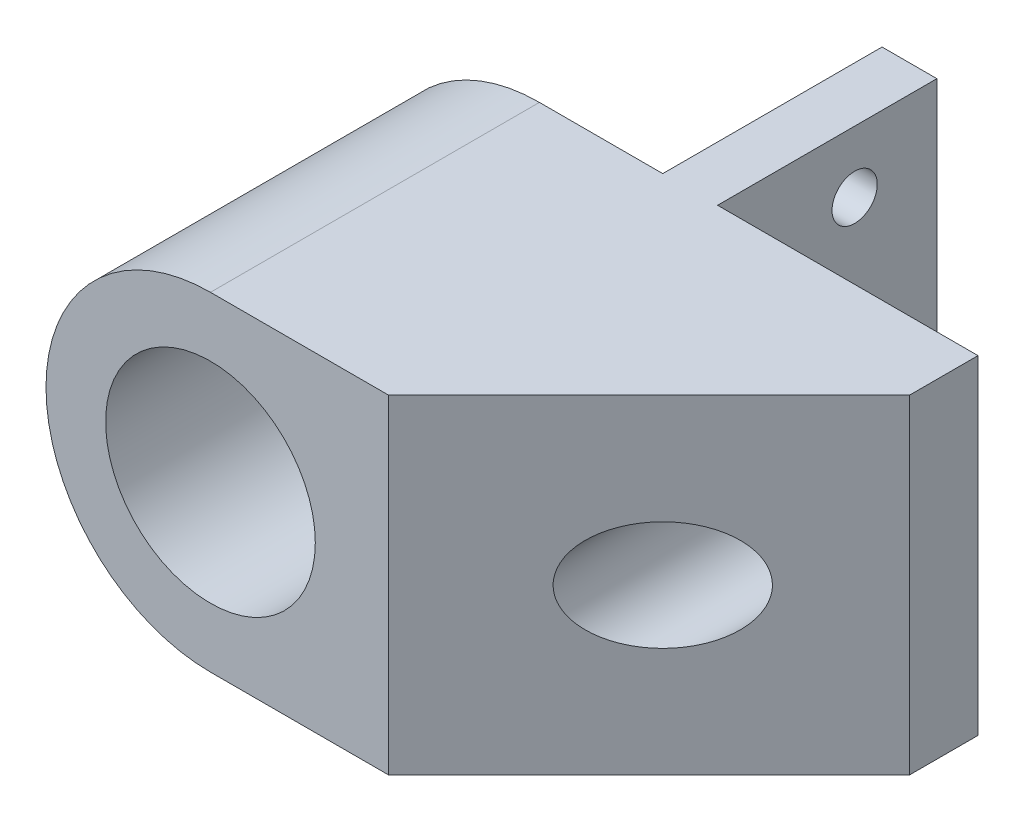
ISO-10303-21;
HEADER;
FILE_DESCRIPTION(('STEP AP214'),'2;1');
FILE_NAME('part.step','',(''),(''),'','','');
FILE_SCHEMA(('AUTOMOTIVE_DESIGN { 1 0 10303 214 1 1 1 1 }'));
ENDSEC;
DATA;
#1=APPLICATION_CONTEXT('core data for automotive mechanical design processes');
#2=APPLICATION_PROTOCOL_DEFINITION('international standard','automotive_design',2000,#1);
#3=PRODUCT_CONTEXT('',#1,'mechanical');
#4=PRODUCT('Part','Part','',(#3));
#5=PRODUCT_RELATED_PRODUCT_CATEGORY('part','',(#4));
#6=PRODUCT_DEFINITION_FORMATION('','',#4);
#7=PRODUCT_DEFINITION_CONTEXT('part definition',#1,'design');
#8=PRODUCT_DEFINITION('design','',#6,#7);
#9=PRODUCT_DEFINITION_SHAPE('','',#8);
#10=(LENGTH_UNIT() NAMED_UNIT(*) SI_UNIT(.MILLI.,.METRE.));
#11=(NAMED_UNIT(*) PLANE_ANGLE_UNIT() SI_UNIT($,.RADIAN.));
#12=(NAMED_UNIT(*) SI_UNIT($,.STERADIAN.) SOLID_ANGLE_UNIT());
#13=UNCERTAINTY_MEASURE_WITH_UNIT(LENGTH_MEASURE(1.E-05),#10,'distance_accuracy_value','');
#14=(GEOMETRIC_REPRESENTATION_CONTEXT(3) GLOBAL_UNCERTAINTY_ASSIGNED_CONTEXT((#13)) GLOBAL_UNIT_ASSIGNED_CONTEXT((#10,
#11,#12)) REPRESENTATION_CONTEXT('',''));
#15=CARTESIAN_POINT('',(0.,0.,0.));
#16=DIRECTION('',(0.,0.,1.));
#17=DIRECTION('',(1.,0.,0.));
#18=AXIS2_PLACEMENT_3D('',#15,#16,#17);
#19=CARTESIAN_POINT('',(-9.,-12.,40.));
#20=DIRECTION('',(0.,0.,-1.));
#21=DIRECTION('',(-1.,0.,0.));
#22=AXIS2_PLACEMENT_3D('',#19,#20,#21);
#23=CYLINDRICAL_SURFACE('',#22,1.6);
#24=CARTESIAN_POINT('',(-9.,-12.,16.));
#25=DIRECTION('',(0.,0.,1.));
#26=DIRECTION('',(1.,0.,0.));
#27=AXIS2_PLACEMENT_3D('',#24,#25,#26);
#28=CIRCLE('',#27,1.6);
#29=CARTESIAN_POINT('',(-7.4,-12.,16.));
#30=VERTEX_POINT('',#29);
#31=EDGE_CURVE('E146',#30,#30,#28,.T.);
#32=ORIENTED_EDGE('',*,*,#31,.F.);
#33=EDGE_LOOP('',(#32));
#34=FACE_BOUND('',#33,.T.);
#35=CARTESIAN_POINT('',(-9.,-12.,21.0000000000002));
#36=DIRECTION('',(0.,0.,1.));
#37=DIRECTION('',(1.,0.,0.));
#38=AXIS2_PLACEMENT_3D('',#35,#36,#37);
#39=CIRCLE('',#38,1.6);
#40=CARTESIAN_POINT('',(-7.4,-12.,21.0000000000002));
#41=VERTEX_POINT('',#40);
#42=EDGE_CURVE('E36',#41,#41,#39,.T.);
#43=ORIENTED_EDGE('',*,*,#42,.T.);
#44=EDGE_LOOP('',(#43));
#45=FACE_BOUND('',#44,.T.);
#46=ADVANCED_FACE('F32',(#34,#45),#23,.F.);
#47=CARTESIAN_POINT('',(-19.,-30.,40.));
#48=DIRECTION('',(-1.,0.,0.));
#49=DIRECTION('',(0.,0.,1.));
#50=AXIS2_PLACEMENT_3D('',#47,#48,#49);
#51=PLANE('',#50);
#52=CARTESIAN_POINT('',(-19.,-4.5,6.00000000000001));
#53=DIRECTION('',(-1.,0.,0.));
#54=DIRECTION('',(0.,0.,1.));
#55=AXIS2_PLACEMENT_3D('',#52,#53,#54);
#56=CIRCLE('',#55,1.65);
#57=CARTESIAN_POINT('',(-19.,-4.5,7.65000000000001));
#58=VERTEX_POINT('',#57);
#59=EDGE_CURVE('E154',#58,#58,#56,.T.);
#60=ORIENTED_EDGE('',*,*,#59,.T.);
#61=EDGE_LOOP('',(#60));
#62=FACE_BOUND('',#61,.T.);
#63=CARTESIAN_POINT('',(-19.,-19.5,6.00000000000001));
#64=DIRECTION('',(-1.,0.,0.));
#65=DIRECTION('',(0.,0.,1.));
#66=AXIS2_PLACEMENT_3D('',#63,#64,#65);
#67=CIRCLE('',#66,1.65);
#68=CARTESIAN_POINT('',(-19.,-19.5,7.65000000000001));
#69=VERTEX_POINT('',#68);
#70=EDGE_CURVE('E159',#69,#69,#67,.T.);
#71=ORIENTED_EDGE('',*,*,#70,.T.);
#72=EDGE_LOOP('',(#71));
#73=FACE_BOUND('',#72,.T.);
#74=DIRECTION('',(0.,1.,0.));
#75=VECTOR('',#74,1.);
#76=CARTESIAN_POINT('',(-19.,-30.,0.));
#77=LINE('',#76,#75);
#78=CARTESIAN_POINT('',(-19.,-24.,0.));
#79=VERTEX_POINT('',#78);
#80=CARTESIAN_POINT('',(-19.,0.,0.));
#81=VERTEX_POINT('',#80);
#82=EDGE_CURVE('E119',#79,#81,#77,.T.);
#83=ORIENTED_EDGE('',*,*,#82,.T.);
#84=DIRECTION('',(0.,0.,1.));
#85=VECTOR('',#84,1.);
#86=CARTESIAN_POINT('',(-19.,0.,40.));
#87=LINE('',#86,#85);
#88=CARTESIAN_POINT('',(-19.,0.,16.));
#89=VERTEX_POINT('',#88);
#90=EDGE_CURVE('E162',#81,#89,#87,.T.);
#91=ORIENTED_EDGE('',*,*,#90,.T.);
#92=DIRECTION('',(0.,1.,0.));
#93=VECTOR('',#92,1.);
#94=CARTESIAN_POINT('',(-19.,-30.,16.));
#95=LINE('',#94,#93);
#96=CARTESIAN_POINT('',(-19.,-24.,16.));
#97=VERTEX_POINT('',#96);
#98=EDGE_CURVE('E191',#97,#89,#95,.T.);
#99=ORIENTED_EDGE('',*,*,#98,.F.);
#100=DIRECTION('',(0.,0.,-1.));
#101=VECTOR('',#100,1.);
#102=CARTESIAN_POINT('',(-19.,-24.,40.));
#103=LINE('',#102,#101);
#104=EDGE_CURVE('E180',#97,#79,#103,.T.);
#105=ORIENTED_EDGE('',*,*,#104,.T.);
#106=EDGE_LOOP('',(#83,#91,#99,#105));
#107=FACE_BOUND('',#106,.T.);
#108=ADVANCED_FACE('F239',(#62,#73,#107),#51,.F.);
#109=CARTESIAN_POINT('',(-32.,-12.,40.));
#110=DIRECTION('',(0.,0.,1.));
#111=DIRECTION('',(1.,0.,0.));
#112=AXIS2_PLACEMENT_3D('',#109,#110,#111);
#113=PLANE('',#112);
#114=DIRECTION('',(0.,1.,0.));
#115=VECTOR('',#114,1.);
#116=CARTESIAN_POINT('',(-19.,6.,40.));
#117=LINE('',#116,#115);
#118=CARTESIAN_POINT('',(-19.,-24.,40.));
#119=VERTEX_POINT('',#118);
#120=CARTESIAN_POINT('',(-19.,0.,40.));
#121=VERTEX_POINT('',#120);
#122=EDGE_CURVE('E127',#119,#121,#117,.T.);
#123=ORIENTED_EDGE('',*,*,#122,.T.);
#124=DIRECTION('',(-1.,0.,0.));
#125=VECTOR('',#124,1.);
#126=CARTESIAN_POINT('',(-23.,0.,40.));
#127=LINE('',#126,#125);
#128=CARTESIAN_POINT('',(-32.,0.,40.));
#129=VERTEX_POINT('',#128);
#130=EDGE_CURVE('E201',#121,#129,#127,.T.);
#131=ORIENTED_EDGE('',*,*,#130,.T.);
#132=CARTESIAN_POINT('',(-32.,-12.,40.));
#133=DIRECTION('',(0.,0.,1.));
#134=DIRECTION('',(1.,0.,0.));
#135=AXIS2_PLACEMENT_3D('',#132,#133,#134);
#136=CIRCLE('',#135,12.);
#137=CARTESIAN_POINT('',(-32.,-24.,40.));
#138=VERTEX_POINT('',#137);
#139=EDGE_CURVE('E202',#129,#138,#136,.T.);
#140=ORIENTED_EDGE('',*,*,#139,.T.);
#141=DIRECTION('',(1.,0.,0.));
#142=VECTOR('',#141,1.);
#143=CARTESIAN_POINT('',(-32.,-24.,40.));
#144=LINE('',#143,#142);
#145=EDGE_CURVE('E133',#138,#119,#144,.T.);
#146=ORIENTED_EDGE('',*,*,#145,.T.);
#147=EDGE_LOOP('',(#123,#131,#140,#146));
#148=FACE_BOUND('',#147,.T.);
#149=CARTESIAN_POINT('',(-32.,-12.,40.));
#150=DIRECTION('',(0.,0.,1.));
#151=DIRECTION('',(1.,0.,0.));
#152=AXIS2_PLACEMENT_3D('',#149,#150,#151);
#153=CIRCLE('',#152,7.65);
#154=CARTESIAN_POINT('',(-24.35,-12.,40.));
#155=VERTEX_POINT('',#154);
#156=EDGE_CURVE('E125',#155,#155,#153,.T.);
#157=ORIENTED_EDGE('',*,*,#156,.F.);
#158=EDGE_LOOP('',(#157));
#159=FACE_BOUND('',#158,.T.);
#160=ADVANCED_FACE('F209',(#148,#159),#113,.T.);
#161=CARTESIAN_POINT('',(-32.,-12.,0.));
#162=DIRECTION('',(0.,0.,1.));
#163=DIRECTION('',(1.,0.,0.));
#164=AXIS2_PLACEMENT_3D('',#161,#162,#163);
#165=PLANE('',#164);
#166=DIRECTION('',(0.,-1.,0.));
#167=VECTOR('',#166,1.);
#168=CARTESIAN_POINT('',(-23.,-24.,0.));
#169=LINE('',#168,#167);
#170=CARTESIAN_POINT('',(-23.,0.,0.));
#171=VERTEX_POINT('',#170);
#172=CARTESIAN_POINT('',(-23.,-24.,0.));
#173=VERTEX_POINT('',#172);
#174=EDGE_CURVE('E117',#171,#173,#169,.T.);
#175=ORIENTED_EDGE('',*,*,#174,.F.);
#176=DIRECTION('',(-1.,0.,0.));
#177=VECTOR('',#176,1.);
#178=CARTESIAN_POINT('',(-3.,0.,0.));
#179=LINE('',#178,#177);
#180=EDGE_CURVE('E110',#81,#171,#179,.T.);
#181=ORIENTED_EDGE('',*,*,#180,.F.);
#182=ORIENTED_EDGE('',*,*,#82,.F.);
#183=DIRECTION('',(-1.,0.,0.));
#184=VECTOR('',#183,1.);
#185=CARTESIAN_POINT('',(-3.,-24.,0.));
#186=LINE('',#185,#184);
#187=EDGE_CURVE('E101',#79,#173,#186,.T.);
#188=ORIENTED_EDGE('',*,*,#187,.T.);
#189=EDGE_LOOP('',(#175,#181,#182,#188));
#190=FACE_BOUND('',#189,.T.);
#191=ADVANCED_FACE('F115',(#190),#165,.F.);
#192=CARTESIAN_POINT('',(0.,-24.,40.));
#193=DIRECTION('',(-1.,0.,0.));
#194=DIRECTION('',(0.,0.,1.));
#195=AXIS2_PLACEMENT_3D('',#192,#193,#194);
#196=PLANE('',#195);
#197=DIRECTION('',(0.,0.,-1.));
#198=VECTOR('',#197,1.);
#199=CARTESIAN_POINT('',(0.,-24.,40.));
#200=LINE('',#199,#198);
#201=CARTESIAN_POINT('',(0.,-24.,21.0000000000002));
#202=VERTEX_POINT('',#201);
#203=CARTESIAN_POINT('',(0.,-24.,16.));
#204=VERTEX_POINT('',#203);
#205=EDGE_CURVE('E48',#202,#204,#200,.T.);
#206=ORIENTED_EDGE('',*,*,#205,.T.);
#207=DIRECTION('',(0.,1.,0.));
#208=VECTOR('',#207,1.);
#209=CARTESIAN_POINT('',(0.,-30.,16.));
#210=LINE('',#209,#208);
#211=CARTESIAN_POINT('',(0.,0.,16.));
#212=VERTEX_POINT('',#211);
#213=EDGE_CURVE('E188',#204,#212,#210,.T.);
#214=ORIENTED_EDGE('',*,*,#213,.T.);
#215=DIRECTION('',(0.,0.,-1.));
#216=VECTOR('',#215,1.);
#217=CARTESIAN_POINT('',(0.,0.,40.));
#218=LINE('',#217,#216);
#219=CARTESIAN_POINT('',(0.,0.,21.0000000000002));
#220=VERTEX_POINT('',#219);
#221=EDGE_CURVE('E142',#220,#212,#218,.T.);
#222=ORIENTED_EDGE('',*,*,#221,.F.);
#223=DIRECTION('',(0.,1.,0.));
#224=VECTOR('',#223,1.);
#225=CARTESIAN_POINT('',(0.,-24.,21.0000000000002));
#226=LINE('',#225,#224);
#227=EDGE_CURVE('E42',#220,#202,#226,.F.);
#228=ORIENTED_EDGE('',*,*,#227,.T.);
#229=EDGE_LOOP('',(#206,#214,#222,#228));
#230=FACE_BOUND('',#229,.T.);
#231=ADVANCED_FACE('F257',(#230),#196,.F.);
#232=CARTESIAN_POINT('',(-23.,0.,40.));
#233=DIRECTION('',(0.,-1.,0.));
#234=DIRECTION('',(1.,0.,0.));
#235=AXIS2_PLACEMENT_3D('',#232,#233,#234);
#236=PLANE('',#235);
#237=ORIENTED_EDGE('',*,*,#130,.F.);
#238=DIRECTION('',(-0.707106781186544,0.,0.707106781186551));
#239=VECTOR('',#238,1.);
#240=CARTESIAN_POINT('',(-20.9999999999998,0.,42.0000000000002));
#241=LINE('',#240,#239);
#242=EDGE_CURVE('E145',#121,#220,#241,.F.);
#243=ORIENTED_EDGE('',*,*,#242,.T.);
#244=ORIENTED_EDGE('',*,*,#221,.T.);
#245=DIRECTION('',(1.,0.,0.));
#246=VECTOR('',#245,1.);
#247=CARTESIAN_POINT('',(0.,0.,16.));
#248=LINE('',#247,#246);
#249=EDGE_CURVE('E157',#89,#212,#248,.T.);
#250=ORIENTED_EDGE('',*,*,#249,.F.);
#251=ORIENTED_EDGE('',*,*,#90,.F.);
#252=ORIENTED_EDGE('',*,*,#180,.T.);
#253=DIRECTION('',(0.,0.,1.));
#254=VECTOR('',#253,1.);
#255=CARTESIAN_POINT('',(-23.,0.,0.));
#256=LINE('',#255,#254);
#257=CARTESIAN_POINT('',(-23.,0.,16.));
#258=VERTEX_POINT('',#257);
#259=EDGE_CURVE('E124',#171,#258,#256,.T.);
#260=ORIENTED_EDGE('',*,*,#259,.T.);
#261=DIRECTION('',(1.,0.,0.));
#262=VECTOR('',#261,1.);
#263=CARTESIAN_POINT('',(-44.,0.,16.));
#264=LINE('',#263,#262);
#265=CARTESIAN_POINT('',(-32.,0.,16.));
#266=VERTEX_POINT('',#265);
#267=EDGE_CURVE('E185',#266,#258,#264,.T.);
#268=ORIENTED_EDGE('',*,*,#267,.F.);
#269=DIRECTION('',(0.,0.,-1.));
#270=VECTOR('',#269,1.);
#271=CARTESIAN_POINT('',(-32.,0.,40.));
#272=LINE('',#271,#270);
#273=EDGE_CURVE('E139',#129,#266,#272,.T.);
#274=ORIENTED_EDGE('',*,*,#273,.F.);
#275=EDGE_LOOP('',(#237,#243,#244,#250,#251,#252,#260,#268,#274));
#276=FACE_BOUND('',#275,.T.);
#277=ADVANCED_FACE('F217',(#276),#236,.F.);
#278=CARTESIAN_POINT('',(-32.,-12.,40.));
#279=DIRECTION('',(0.,0.,-1.));
#280=DIRECTION('',(-1.,0.,0.));
#281=AXIS2_PLACEMENT_3D('',#278,#279,#280);
#282=CYLINDRICAL_SURFACE('',#281,12.);
#283=ORIENTED_EDGE('',*,*,#273,.T.);
#284=CARTESIAN_POINT('',(-32.,-12.,16.));
#285=DIRECTION('',(0.,0.,1.));
#286=DIRECTION('',(1.,0.,0.));
#287=AXIS2_PLACEMENT_3D('',#284,#285,#286);
#288=CIRCLE('',#287,12.);
#289=CARTESIAN_POINT('',(-32.,-24.,16.));
#290=VERTEX_POINT('',#289);
#291=EDGE_CURVE('E130',#266,#290,#288,.T.);
#292=ORIENTED_EDGE('',*,*,#291,.T.);
#293=DIRECTION('',(0.,0.,-1.));
#294=VECTOR('',#293,1.);
#295=CARTESIAN_POINT('',(-32.,-24.,40.));
#296=LINE('',#295,#294);
#297=EDGE_CURVE('E137',#138,#290,#296,.T.);
#298=ORIENTED_EDGE('',*,*,#297,.F.);
#299=ORIENTED_EDGE('',*,*,#139,.F.);
#300=EDGE_LOOP('',(#283,#292,#298,#299));
#301=FACE_BOUND('',#300,.T.);
#302=ADVANCED_FACE('F220',(#301),#282,.T.);
#303=CARTESIAN_POINT('',(-23.,-24.,40.));
#304=DIRECTION('',(1.,0.,0.));
#305=DIRECTION('',(0.,0.,-1.));
#306=AXIS2_PLACEMENT_3D('',#303,#304,#305);
#307=PLANE('',#306);
#308=CARTESIAN_POINT('',(-23.,-19.5,6.00000000000001));
#309=DIRECTION('',(-1.,0.,0.));
#310=DIRECTION('',(0.,0.,1.));
#311=AXIS2_PLACEMENT_3D('',#308,#309,#310);
#312=CIRCLE('',#311,1.65);
#313=CARTESIAN_POINT('',(-23.,-19.5,7.65000000000001));
#314=VERTEX_POINT('',#313);
#315=EDGE_CURVE('E120',#314,#314,#312,.T.);
#316=ORIENTED_EDGE('',*,*,#315,.F.);
#317=EDGE_LOOP('',(#316));
#318=FACE_BOUND('',#317,.T.);
#319=CARTESIAN_POINT('',(-23.,-4.5,6.00000000000001));
#320=DIRECTION('',(-1.,0.,0.));
#321=DIRECTION('',(0.,0.,1.));
#322=AXIS2_PLACEMENT_3D('',#319,#320,#321);
#323=CIRCLE('',#322,1.65);
#324=CARTESIAN_POINT('',(-23.,-4.5,7.65000000000001));
#325=VERTEX_POINT('',#324);
#326=EDGE_CURVE('E158',#325,#325,#323,.T.);
#327=ORIENTED_EDGE('',*,*,#326,.F.);
#328=EDGE_LOOP('',(#327));
#329=FACE_BOUND('',#328,.T.);
#330=DIRECTION('',(0.,1.,0.));
#331=VECTOR('',#330,1.);
#332=CARTESIAN_POINT('',(-23.,-30.,16.));
#333=LINE('',#332,#331);
#334=CARTESIAN_POINT('',(-23.,-24.,16.));
#335=VERTEX_POINT('',#334);
#336=EDGE_CURVE('E150',#335,#258,#333,.T.);
#337=ORIENTED_EDGE('',*,*,#336,.T.);
#338=ORIENTED_EDGE('',*,*,#259,.F.);
#339=ORIENTED_EDGE('',*,*,#174,.T.);
#340=DIRECTION('',(0.,0.,-1.));
#341=VECTOR('',#340,1.);
#342=CARTESIAN_POINT('',(-23.,-24.,40.));
#343=LINE('',#342,#341);
#344=EDGE_CURVE('E98',#335,#173,#343,.T.);
#345=ORIENTED_EDGE('',*,*,#344,.F.);
#346=EDGE_LOOP('',(#337,#338,#339,#345));
#347=FACE_BOUND('',#346,.T.);
#348=ADVANCED_FACE('F123',(#318,#329,#347),#307,.F.);
#349=CARTESIAN_POINT('',(-19.,-24.,40.));
#350=DIRECTION('',(0.,1.,0.));
#351=DIRECTION('',(0.,0.,1.));
#352=AXIS2_PLACEMENT_3D('',#349,#350,#351);
#353=PLANE('',#352);
#354=ORIENTED_EDGE('',*,*,#205,.F.);
#355=DIRECTION('',(0.707106781186544,0.,-0.707106781186551));
#356=VECTOR('',#355,1.);
#357=CARTESIAN_POINT('',(-18.9999999999998,-24.,40.0000000000002));
#358=LINE('',#357,#356);
#359=EDGE_CURVE('E11',#202,#119,#358,.F.);
#360=ORIENTED_EDGE('',*,*,#359,.T.);
#361=ORIENTED_EDGE('',*,*,#145,.F.);
#362=ORIENTED_EDGE('',*,*,#297,.T.);
#363=DIRECTION('',(1.,0.,0.));
#364=VECTOR('',#363,1.);
#365=CARTESIAN_POINT('',(-32.,-24.,16.));
#366=LINE('',#365,#364);
#367=EDGE_CURVE('E105',#290,#335,#366,.T.);
#368=ORIENTED_EDGE('',*,*,#367,.T.);
#369=ORIENTED_EDGE('',*,*,#344,.T.);
#370=ORIENTED_EDGE('',*,*,#187,.F.);
#371=ORIENTED_EDGE('',*,*,#104,.F.);
#372=DIRECTION('',(1.,0.,0.));
#373=VECTOR('',#372,1.);
#374=CARTESIAN_POINT('',(-19.,-24.,16.));
#375=LINE('',#374,#373);
#376=EDGE_CURVE('E149',#97,#204,#375,.T.);
#377=ORIENTED_EDGE('',*,*,#376,.T.);
#378=EDGE_LOOP('',(#354,#360,#361,#362,#368,#369,#370,#371,#377));
#379=FACE_BOUND('',#378,.T.);
#380=ADVANCED_FACE('F100',(#379),#353,.F.);
#381=CARTESIAN_POINT('',(-32.,-12.,40.));
#382=DIRECTION('',(0.,0.,-1.));
#383=DIRECTION('',(-1.,0.,0.));
#384=AXIS2_PLACEMENT_3D('',#381,#382,#383);
#385=CYLINDRICAL_SURFACE('',#384,7.65);
#386=CARTESIAN_POINT('',(-32.,-12.,16.));
#387=DIRECTION('',(0.,0.,1.));
#388=DIRECTION('',(1.,0.,0.));
#389=AXIS2_PLACEMENT_3D('',#386,#387,#388);
#390=CIRCLE('',#389,7.65);
#391=CARTESIAN_POINT('',(-24.35,-12.,16.));
#392=VERTEX_POINT('',#391);
#393=EDGE_CURVE('E151',#392,#392,#390,.T.);
#394=ORIENTED_EDGE('',*,*,#393,.F.);
#395=EDGE_LOOP('',(#394));
#396=FACE_BOUND('',#395,.T.);
#397=ORIENTED_EDGE('',*,*,#156,.T.);
#398=EDGE_LOOP('',(#397));
#399=FACE_BOUND('',#398,.T.);
#400=ADVANCED_FACE('F235',(#396,#399),#385,.F.);
#401=CARTESIAN_POINT('',(0.,-30.,16.));
#402=DIRECTION('',(0.,0.,1.));
#403=DIRECTION('',(1.,0.,0.));
#404=AXIS2_PLACEMENT_3D('',#401,#402,#403);
#405=PLANE('',#404);
#406=ORIENTED_EDGE('',*,*,#31,.T.);
#407=EDGE_LOOP('',(#406));
#408=FACE_BOUND('',#407,.T.);
#409=ORIENTED_EDGE('',*,*,#98,.T.);
#410=ORIENTED_EDGE('',*,*,#249,.T.);
#411=ORIENTED_EDGE('',*,*,#213,.F.);
#412=ORIENTED_EDGE('',*,*,#376,.F.);
#413=EDGE_LOOP('',(#409,#410,#411,#412));
#414=FACE_BOUND('',#413,.T.);
#415=ADVANCED_FACE('F225',(#408,#414),#405,.F.);
#416=CARTESIAN_POINT('',(-44.,-30.,16.));
#417=DIRECTION('',(0.,0.,1.));
#418=DIRECTION('',(1.,0.,0.));
#419=AXIS2_PLACEMENT_3D('',#416,#417,#418);
#420=PLANE('',#419);
#421=ORIENTED_EDGE('',*,*,#393,.T.);
#422=EDGE_LOOP('',(#421));
#423=FACE_BOUND('',#422,.T.);
#424=ORIENTED_EDGE('',*,*,#267,.T.);
#425=ORIENTED_EDGE('',*,*,#336,.F.);
#426=ORIENTED_EDGE('',*,*,#367,.F.);
#427=ORIENTED_EDGE('',*,*,#291,.F.);
#428=EDGE_LOOP('',(#424,#425,#426,#427));
#429=FACE_BOUND('',#428,.T.);
#430=ADVANCED_FACE('F222',(#423,#429),#420,.F.);
#431=CARTESIAN_POINT('',(-3.,-4.5,6.00000000000001));
#432=DIRECTION('',(-1.,0.,0.));
#433=DIRECTION('',(0.,0.,1.));
#434=AXIS2_PLACEMENT_3D('',#431,#432,#433);
#435=CYLINDRICAL_SURFACE('',#434,1.65);
#436=ORIENTED_EDGE('',*,*,#326,.T.);
#437=EDGE_LOOP('',(#436));
#438=FACE_BOUND('',#437,.T.);
#439=ORIENTED_EDGE('',*,*,#59,.F.);
#440=EDGE_LOOP('',(#439));
#441=FACE_BOUND('',#440,.T.);
#442=ADVANCED_FACE('F224',(#438,#441),#435,.F.);
#443=CARTESIAN_POINT('',(-3.,-19.5,6.00000000000001));
#444=DIRECTION('',(-1.,0.,0.));
#445=DIRECTION('',(0.,0.,1.));
#446=AXIS2_PLACEMENT_3D('',#443,#444,#445);
#447=CYLINDRICAL_SURFACE('',#446,1.65);
#448=ORIENTED_EDGE('',*,*,#315,.T.);
#449=EDGE_LOOP('',(#448));
#450=FACE_BOUND('',#449,.T.);
#451=ORIENTED_EDGE('',*,*,#70,.F.);
#452=EDGE_LOOP('',(#451));
#453=FACE_BOUND('',#452,.T.);
#454=ADVANCED_FACE('F232',(#450,#453),#447,.F.);
#455=CARTESIAN_POINT('',(-19.,-30.,40.0000000000004));
#456=DIRECTION('',(0.707106781186551,0.,0.707106781186544));
#457=DIRECTION('',(0.,-1.,0.));
#458=AXIS2_PLACEMENT_3D('',#455,#456,#457);
#459=PLANE('',#458);
#460=CARTESIAN_POINT('',(-9.,-12.,30.0000000000003));
#461=DIRECTION('',(0.707106781186551,0.,0.707106781186544));
#462=DIRECTION('',(-0.707106781186544,0.,0.707106781186551));
#463=AXIS2_PLACEMENT_3D('',#460,#461,#462);
#464=ELLIPSE('',#463,5.65685424949241,4.);
#465=CARTESIAN_POINT('',(-13.,-12.,34.0000000000003));
#466=VERTEX_POINT('',#465);
#467=EDGE_CURVE('E165',#466,#466,#464,.F.);
#468=ORIENTED_EDGE('',*,*,#467,.T.);
#469=EDGE_LOOP('',(#468));
#470=FACE_BOUND('',#469,.T.);
#471=ORIENTED_EDGE('',*,*,#359,.F.);
#472=ORIENTED_EDGE('',*,*,#227,.F.);
#473=ORIENTED_EDGE('',*,*,#242,.F.);
#474=ORIENTED_EDGE('',*,*,#122,.F.);
#475=EDGE_LOOP('',(#471,#472,#473,#474));
#476=FACE_BOUND('',#475,.T.);
#477=ADVANCED_FACE('F34',(#470,#476),#459,.T.);
#478=CARTESIAN_POINT('',(-9.,-12.,21.0000000000002));
#479=DIRECTION('',(0.,0.,1.));
#480=DIRECTION('',(1.,0.,0.));
#481=AXIS2_PLACEMENT_3D('',#478,#479,#480);
#482=CYLINDRICAL_SURFACE('',#481,4.);
#483=CARTESIAN_POINT('',(-9.,-12.,21.0000000000002));
#484=DIRECTION('',(0.,0.,1.));
#485=DIRECTION('',(1.,0.,0.));
#486=AXIS2_PLACEMENT_3D('',#483,#484,#485);
#487=CIRCLE('',#486,4.);
#488=CARTESIAN_POINT('',(-5.,-12.,21.0000000000002));
#489=VERTEX_POINT('',#488);
#490=EDGE_CURVE('E167',#489,#489,#487,.T.);
#491=ORIENTED_EDGE('',*,*,#490,.F.);
#492=EDGE_LOOP('',(#491));
#493=FACE_BOUND('',#492,.T.);
#494=ORIENTED_EDGE('',*,*,#467,.F.);
#495=EDGE_LOOP('',(#494));
#496=FACE_BOUND('',#495,.T.);
#497=ADVANCED_FACE('F385',(#493,#496),#482,.F.);
#498=CARTESIAN_POINT('',(-9.,-12.,21.0000000000002));
#499=DIRECTION('',(0.,0.,1.));
#500=DIRECTION('',(1.,0.,0.));
#501=AXIS2_PLACEMENT_3D('',#498,#499,#500);
#502=PLANE('',#501);
#503=ORIENTED_EDGE('',*,*,#42,.F.);
#504=EDGE_LOOP('',(#503));
#505=FACE_BOUND('',#504,.T.);
#506=ORIENTED_EDGE('',*,*,#490,.T.);
#507=EDGE_LOOP('',(#506));
#508=FACE_BOUND('',#507,.T.);
#509=ADVANCED_FACE('F390',(#505,#508),#502,.T.);
#510=CLOSED_SHELL('',(#46,#108,#160,#191,#231,#277,#302,#348,#380,#400,#415,#430,#442,#454,#477,
#497,#509));
#511=MANIFOLD_SOLID_BREP('B2',#510);
#512=ADVANCED_BREP_SHAPE_REPRESENTATION('',(#18,#511),#14);
#513=SHAPE_DEFINITION_REPRESENTATION(#9,#512);
ENDSEC;
END-ISO-10303-21;
